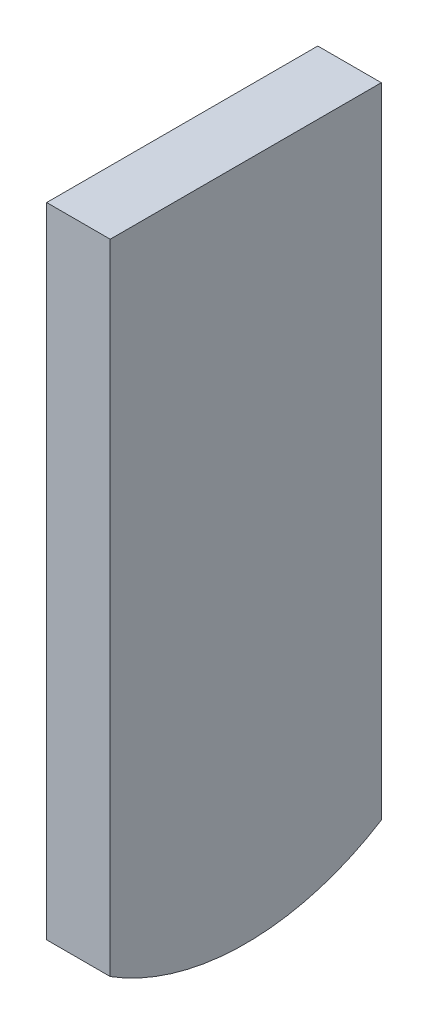
ISO-10303-21;
HEADER;
FILE_DESCRIPTION(('STEP AP214'),'2;1');
FILE_NAME('part.step','',(''),(''),'','','');
FILE_SCHEMA(('AUTOMOTIVE_DESIGN { 1 0 10303 214 1 1 1 1 }'));
ENDSEC;
DATA;
#1=APPLICATION_CONTEXT('core data for automotive mechanical design processes');
#2=APPLICATION_PROTOCOL_DEFINITION('international standard','automotive_design',2000,#1);
#3=PRODUCT_CONTEXT('',#1,'mechanical');
#4=PRODUCT('Part','Part','',(#3));
#5=PRODUCT_RELATED_PRODUCT_CATEGORY('part','',(#4));
#6=PRODUCT_DEFINITION_FORMATION('','',#4);
#7=PRODUCT_DEFINITION_CONTEXT('part definition',#1,'design');
#8=PRODUCT_DEFINITION('design','',#6,#7);
#9=PRODUCT_DEFINITION_SHAPE('','',#8);
#10=(LENGTH_UNIT() NAMED_UNIT(*) SI_UNIT(.MILLI.,.METRE.));
#11=(NAMED_UNIT(*) PLANE_ANGLE_UNIT() SI_UNIT($,.RADIAN.));
#12=(NAMED_UNIT(*) SI_UNIT($,.STERADIAN.) SOLID_ANGLE_UNIT());
#13=UNCERTAINTY_MEASURE_WITH_UNIT(LENGTH_MEASURE(1.E-05),#10,'distance_accuracy_value','');
#14=(GEOMETRIC_REPRESENTATION_CONTEXT(3) GLOBAL_UNCERTAINTY_ASSIGNED_CONTEXT((#13)) GLOBAL_UNIT_ASSIGNED_CONTEXT((#10,
#11,#12)) REPRESENTATION_CONTEXT('',''));
#15=CARTESIAN_POINT('',(0.,0.,0.));
#16=DIRECTION('',(0.,0.,1.));
#17=DIRECTION('',(1.,0.,0.));
#18=AXIS2_PLACEMENT_3D('',#15,#16,#17);
#19=CARTESIAN_POINT('',(22.5596096334287,-9.99999999999998,0.));
#20=DIRECTION('',(-0.999999999999997,0.,0.));
#21=DIRECTION('',(0.,0.,0.999999999999997));
#22=AXIS2_PLACEMENT_3D('',#19,#20,#21);
#23=CYLINDRICAL_SURFACE('',#22,6.);
#24=DIRECTION('',(-0.999999999999997,0.,0.));
#25=VECTOR('',#24,1.);
#26=CARTESIAN_POINT('',(22.5596096334285,-15.0754310161798,-3.19999999999993));
#27=LINE('',#26,#25);
#28=CARTESIAN_POINT('',(0.750000000000141,-15.0754310161798,-3.19999999999997));
#29=VERTEX_POINT('',#28);
#30=CARTESIAN_POINT('',(-0.749999999999917,-15.0754310161798,-3.19999999999987));
#31=VERTEX_POINT('',#30);
#32=EDGE_CURVE('E90',#29,#31,#27,.T.);
#33=ORIENTED_EDGE('',*,*,#32,.F.);
#34=CARTESIAN_POINT('',(0.750000000000001,-10.,0.));
#35=DIRECTION('',(0.999999999999997,0.,0.));
#36=DIRECTION('',(0.,0.,-0.999999999999997));
#37=AXIS2_PLACEMENT_3D('',#34,#35,#36);
#38=CIRCLE('',#37,6.);
#39=CARTESIAN_POINT('',(0.750000000000197,-15.0754310161798,3.20000000000014));
#40=VERTEX_POINT('',#39);
#41=EDGE_CURVE('E62',#29,#40,#38,.F.);
#42=ORIENTED_EDGE('',*,*,#41,.T.);
#43=DIRECTION('',(-0.999999999999997,0.,0.));
#44=VECTOR('',#43,1.);
#45=CARTESIAN_POINT('',(22.5596096334285,-15.0754310161798,3.19999999999998));
#46=LINE('',#45,#44);
#47=CARTESIAN_POINT('',(-0.750000000000028,-15.0754310161798,3.19999999999998));
#48=VERTEX_POINT('',#47);
#49=EDGE_CURVE('E101',#40,#48,#46,.T.);
#50=ORIENTED_EDGE('',*,*,#49,.T.);
#51=CARTESIAN_POINT('',(-0.74999999999964,-10.,0.));
#52=DIRECTION('',(-0.999999999999997,0.,0.));
#53=DIRECTION('',(0.,0.,0.999999999999997));
#54=AXIS2_PLACEMENT_3D('',#51,#52,#53);
#55=CIRCLE('',#54,6.);
#56=EDGE_CURVE('E70',#48,#31,#55,.F.);
#57=ORIENTED_EDGE('',*,*,#56,.T.);
#58=EDGE_LOOP('',(#33,#42,#50,#57));
#59=FACE_BOUND('',#58,.T.);
#60=ADVANCED_FACE('F45',(#59),#23,.T.);
#61=CARTESIAN_POINT('',(0.750000000000197,-15.9999999999999,3.20000000000014));
#62=DIRECTION('',(0.999999999999997,0.,0.));
#63=DIRECTION('',(0.,0.,-0.999999999999997));
#64=AXIS2_PLACEMENT_3D('',#61,#62,#63);
#65=PLANE('',#64);
#66=ORIENTED_EDGE('',*,*,#41,.F.);
#67=DIRECTION('',(0.,1.,0.));
#68=VECTOR('',#67,1.);
#69=CARTESIAN_POINT('',(0.750000000000141,-15.9999999999999,-3.19999999999997));
#70=LINE('',#69,#68);
#71=CARTESIAN_POINT('',(0.750000000000141,0.,-3.19999999999997));
#72=VERTEX_POINT('',#71);
#73=EDGE_CURVE('E49',#29,#72,#70,.T.);
#74=ORIENTED_EDGE('',*,*,#73,.T.);
#75=DIRECTION('',(0.,0.,-0.999999999999997));
#76=VECTOR('',#75,1.);
#77=CARTESIAN_POINT('',(0.750000000000197,0.,3.20000000000014));
#78=LINE('',#77,#76);
#79=CARTESIAN_POINT('',(0.750000000000197,0.,3.20000000000014));
#80=VERTEX_POINT('',#79);
#81=EDGE_CURVE('E99',#80,#72,#78,.T.);
#82=ORIENTED_EDGE('',*,*,#81,.F.);
#83=DIRECTION('',(0.,1.,0.));
#84=VECTOR('',#83,1.);
#85=CARTESIAN_POINT('',(0.750000000000197,-15.9999999999999,3.20000000000014));
#86=LINE('',#85,#84);
#87=EDGE_CURVE('E13',#40,#80,#86,.T.);
#88=ORIENTED_EDGE('',*,*,#87,.F.);
#89=EDGE_LOOP('',(#66,#74,#82,#88));
#90=FACE_BOUND('',#89,.T.);
#91=ADVANCED_FACE('F47',(#90),#65,.T.);
#92=CARTESIAN_POINT('',(-0.750000000000028,-15.9999999999999,3.19999999999998));
#93=DIRECTION('',(0.,0.,0.999999999999997));
#94=DIRECTION('',(0.999999999999997,0.,0.));
#95=AXIS2_PLACEMENT_3D('',#92,#93,#94);
#96=PLANE('',#95);
#97=ORIENTED_EDGE('',*,*,#49,.F.);
#98=ORIENTED_EDGE('',*,*,#87,.T.);
#99=DIRECTION('',(0.999999999999997,0.,0.));
#100=VECTOR('',#99,1.);
#101=CARTESIAN_POINT('',(-0.750000000000028,0.,3.19999999999998));
#102=LINE('',#101,#100);
#103=CARTESIAN_POINT('',(-0.750000000000028,0.,3.19999999999998));
#104=VERTEX_POINT('',#103);
#105=EDGE_CURVE('E97',#104,#80,#102,.T.);
#106=ORIENTED_EDGE('',*,*,#105,.F.);
#107=DIRECTION('',(0.,1.,0.));
#108=VECTOR('',#107,1.);
#109=CARTESIAN_POINT('',(-0.750000000000028,-15.9999999999999,3.19999999999998));
#110=LINE('',#109,#108);
#111=EDGE_CURVE('E54',#48,#104,#110,.T.);
#112=ORIENTED_EDGE('',*,*,#111,.F.);
#113=EDGE_LOOP('',(#97,#98,#106,#112));
#114=FACE_BOUND('',#113,.T.);
#115=ADVANCED_FACE('F119',(#114),#96,.T.);
#116=CARTESIAN_POINT('',(-0.750000000000028,-15.9999999999999,3.19999999999998));
#117=DIRECTION('',(-0.999999999999997,0.,0.));
#118=DIRECTION('',(0.,0.,0.999999999999997));
#119=AXIS2_PLACEMENT_3D('',#116,#117,#118);
#120=PLANE('',#119);
#121=ORIENTED_EDGE('',*,*,#56,.F.);
#122=ORIENTED_EDGE('',*,*,#111,.T.);
#123=DIRECTION('',(0.,0.,0.999999999999997));
#124=VECTOR('',#123,1.);
#125=CARTESIAN_POINT('',(-0.750000000000028,0.,3.19999999999998));
#126=LINE('',#125,#124);
#127=CARTESIAN_POINT('',(-0.749999999999917,0.,-3.19999999999987));
#128=VERTEX_POINT('',#127);
#129=EDGE_CURVE('E108',#128,#104,#126,.T.);
#130=ORIENTED_EDGE('',*,*,#129,.F.);
#131=DIRECTION('',(0.,1.,0.));
#132=VECTOR('',#131,1.);
#133=CARTESIAN_POINT('',(-0.749999999999917,-15.9999999999999,-3.19999999999987));
#134=LINE('',#133,#132);
#135=EDGE_CURVE('E96',#31,#128,#134,.T.);
#136=ORIENTED_EDGE('',*,*,#135,.F.);
#137=EDGE_LOOP('',(#121,#122,#130,#136));
#138=FACE_BOUND('',#137,.T.);
#139=ADVANCED_FACE('F114',(#138),#120,.T.);
#140=CARTESIAN_POINT('',(-0.749999999999917,-15.9999999999999,-3.19999999999987));
#141=DIRECTION('',(0.,0.,-0.999999999999997));
#142=DIRECTION('',(-0.999999999999997,0.,0.));
#143=AXIS2_PLACEMENT_3D('',#140,#141,#142);
#144=PLANE('',#143);
#145=ORIENTED_EDGE('',*,*,#32,.T.);
#146=ORIENTED_EDGE('',*,*,#135,.T.);
#147=DIRECTION('',(-0.999999999999997,0.,0.));
#148=VECTOR('',#147,1.);
#149=CARTESIAN_POINT('',(-0.749999999999917,0.,-3.19999999999987));
#150=LINE('',#149,#148);
#151=EDGE_CURVE('E92',#72,#128,#150,.T.);
#152=ORIENTED_EDGE('',*,*,#151,.F.);
#153=ORIENTED_EDGE('',*,*,#73,.F.);
#154=EDGE_LOOP('',(#145,#146,#152,#153));
#155=FACE_BOUND('',#154,.T.);
#156=ADVANCED_FACE('F89',(#155),#144,.T.);
#157=CARTESIAN_POINT('',(0.,0.,0.));
#158=DIRECTION('',(0.,-1.,0.));
#159=DIRECTION('',(0.,0.,-0.999999999999997));
#160=AXIS2_PLACEMENT_3D('',#157,#158,#159);
#161=PLANE('',#160);
#162=ORIENTED_EDGE('',*,*,#81,.T.);
#163=ORIENTED_EDGE('',*,*,#151,.T.);
#164=ORIENTED_EDGE('',*,*,#129,.T.);
#165=ORIENTED_EDGE('',*,*,#105,.T.);
#166=EDGE_LOOP('',(#162,#163,#164,#165));
#167=FACE_BOUND('',#166,.T.);
#168=ADVANCED_FACE('F117',(#167),#161,.F.);
#169=CLOSED_SHELL('',(#60,#91,#115,#139,#156,#168));
#170=MANIFOLD_SOLID_BREP('B2',#169);
#171=ADVANCED_BREP_SHAPE_REPRESENTATION('',(#18,#170),#14);
#172=SHAPE_DEFINITION_REPRESENTATION(#9,#171);
ENDSEC;
END-ISO-10303-21;
